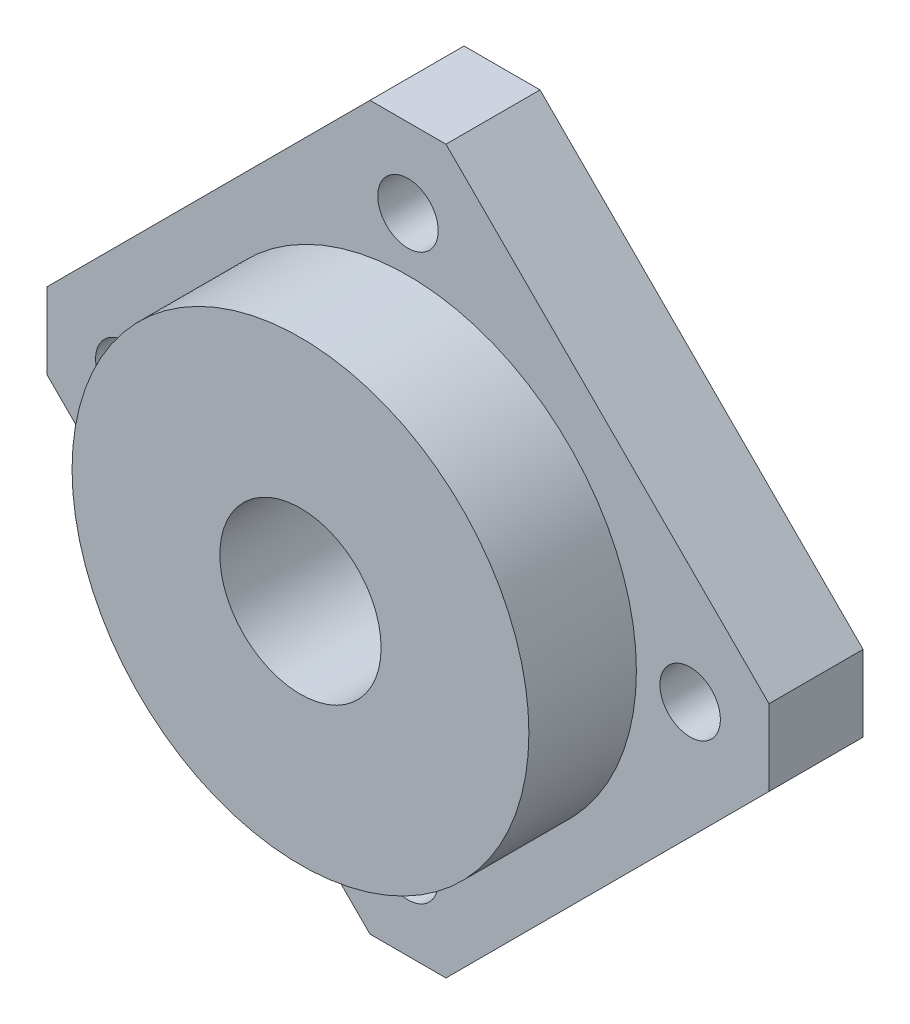
ISO-10303-21;
HEADER;
FILE_DESCRIPTION(('STEP AP214'),'2;1');
FILE_NAME('part.step','',(''),(''),'','','');
FILE_SCHEMA(('AUTOMOTIVE_DESIGN { 1 0 10303 214 1 1 1 1 }'));
ENDSEC;
DATA;
#1=APPLICATION_CONTEXT('core data for automotive mechanical design processes');
#2=APPLICATION_PROTOCOL_DEFINITION('international standard','automotive_design',2000,#1);
#3=PRODUCT_CONTEXT('',#1,'mechanical');
#4=PRODUCT('Part','Part','',(#3));
#5=PRODUCT_RELATED_PRODUCT_CATEGORY('part','',(#4));
#6=PRODUCT_DEFINITION_FORMATION('','',#4);
#7=PRODUCT_DEFINITION_CONTEXT('part definition',#1,'design');
#8=PRODUCT_DEFINITION('design','',#6,#7);
#9=PRODUCT_DEFINITION_SHAPE('','',#8);
#10=(LENGTH_UNIT() NAMED_UNIT(*) SI_UNIT(.MILLI.,.METRE.));
#11=(NAMED_UNIT(*) PLANE_ANGLE_UNIT() SI_UNIT($,.RADIAN.));
#12=(NAMED_UNIT(*) SI_UNIT($,.STERADIAN.) SOLID_ANGLE_UNIT());
#13=UNCERTAINTY_MEASURE_WITH_UNIT(LENGTH_MEASURE(1.E-05),#10,'distance_accuracy_value','');
#14=(GEOMETRIC_REPRESENTATION_CONTEXT(3) GLOBAL_UNCERTAINTY_ASSIGNED_CONTEXT((#13)) GLOBAL_UNIT_ASSIGNED_CONTEXT((#10,
#11,#12)) REPRESENTATION_CONTEXT('',''));
#15=CARTESIAN_POINT('',(0.,0.,0.));
#16=DIRECTION('',(0.,0.,1.));
#17=DIRECTION('',(1.,0.,0.));
#18=AXIS2_PLACEMENT_3D('',#15,#16,#17);
#19=CARTESIAN_POINT('',(0.,0.,7.));
#20=DIRECTION('',(0.,0.,-1.));
#21=DIRECTION('',(-1.,0.,0.));
#22=AXIS2_PLACEMENT_3D('',#19,#20,#21);
#23=PLANE('',#22);
#24=DIRECTION('',(0.707106781186547,-0.707106781186548,0.));
#25=VECTOR('',#24,1.);
#26=CARTESIAN_POINT('',(0.,-29.698484809835,7.));
#27=LINE('',#26,#25);
#28=CARTESIAN_POINT('',(-26.8700576850888,-2.8284271247462,7.));
#29=VERTEX_POINT('',#28);
#30=CARTESIAN_POINT('',(-2.8284271247462,-26.8700576850888,7.));
#31=VERTEX_POINT('',#30);
#32=EDGE_CURVE('E123',#29,#31,#27,.T.);
#33=ORIENTED_EDGE('',*,*,#32,.T.);
#34=DIRECTION('',(-1.,0.,0.));
#35=VECTOR('',#34,1.);
#36=CARTESIAN_POINT('',(2.82842712474619,-26.8700576850888,7.));
#37=LINE('',#36,#35);
#38=CARTESIAN_POINT('',(2.82842712474619,-26.8700576850888,7.));
#39=VERTEX_POINT('',#38);
#40=EDGE_CURVE('E11',#31,#39,#37,.F.);
#41=ORIENTED_EDGE('',*,*,#40,.T.);
#42=DIRECTION('',(0.707106781186547,0.707106781186547,0.));
#43=VECTOR('',#42,1.);
#44=CARTESIAN_POINT('',(29.698484809835,0.,7.));
#45=LINE('',#44,#43);
#46=CARTESIAN_POINT('',(26.8700576850888,-2.82842712474622,7.));
#47=VERTEX_POINT('',#46);
#48=EDGE_CURVE('E126',#39,#47,#45,.T.);
#49=ORIENTED_EDGE('',*,*,#48,.T.);
#50=DIRECTION('',(0.,-1.,0.));
#51=VECTOR('',#50,1.);
#52=CARTESIAN_POINT('',(26.8700576850888,2.8284271247462,7.));
#53=LINE('',#52,#51);
#54=CARTESIAN_POINT('',(26.8700576850888,2.82842712474619,7.));
#55=VERTEX_POINT('',#54);
#56=EDGE_CURVE('E167',#47,#55,#53,.F.);
#57=ORIENTED_EDGE('',*,*,#56,.T.);
#58=DIRECTION('',(-0.707106781186547,0.707106781186548,0.));
#59=VECTOR('',#58,1.);
#60=CARTESIAN_POINT('',(0.,29.698484809835,7.));
#61=LINE('',#60,#59);
#62=CARTESIAN_POINT('',(2.82842712474621,26.8700576850888,7.));
#63=VERTEX_POINT('',#62);
#64=EDGE_CURVE('E190',#55,#63,#61,.T.);
#65=ORIENTED_EDGE('',*,*,#64,.T.);
#66=DIRECTION('',(1.,0.,0.));
#67=VECTOR('',#66,1.);
#68=CARTESIAN_POINT('',(-2.82842712474619,26.8700576850888,7.));
#69=LINE('',#68,#67);
#70=CARTESIAN_POINT('',(-2.8284271247462,26.8700576850888,7.));
#71=VERTEX_POINT('',#70);
#72=EDGE_CURVE('E156',#63,#71,#69,.F.);
#73=ORIENTED_EDGE('',*,*,#72,.T.);
#74=DIRECTION('',(-0.707106781186548,-0.707106781186547,0.));
#75=VECTOR('',#74,1.);
#76=CARTESIAN_POINT('',(-29.698484809835,0.,7.));
#77=LINE('',#76,#75);
#78=CARTESIAN_POINT('',(-26.8700576850888,2.82842712474621,7.));
#79=VERTEX_POINT('',#78);
#80=EDGE_CURVE('E118',#71,#79,#77,.T.);
#81=ORIENTED_EDGE('',*,*,#80,.T.);
#82=DIRECTION('',(0.,1.,0.));
#83=VECTOR('',#82,1.);
#84=CARTESIAN_POINT('',(-26.8700576850888,-2.8284271247462,7.));
#85=LINE('',#84,#83);
#86=EDGE_CURVE('E175',#79,#29,#85,.F.);
#87=ORIENTED_EDGE('',*,*,#86,.T.);
#88=EDGE_LOOP('',(#33,#41,#49,#57,#65,#73,#81,#87));
#89=FACE_BOUND('',#88,.T.);
#90=CARTESIAN_POINT('',(0.,21.,7.));
#91=DIRECTION('',(0.,0.,1.));
#92=DIRECTION('',(1.,0.,0.));
#93=AXIS2_PLACEMENT_3D('',#90,#91,#92);
#94=CIRCLE('',#93,2.25);
#95=CARTESIAN_POINT('',(2.25,21.,7.));
#96=VERTEX_POINT('',#95);
#97=EDGE_CURVE('E136',#96,#96,#94,.T.);
#98=ORIENTED_EDGE('',*,*,#97,.F.);
#99=EDGE_LOOP('',(#98));
#100=FACE_BOUND('',#99,.T.);
#101=CARTESIAN_POINT('',(21.,0.,7.));
#102=DIRECTION('',(0.,0.,1.));
#103=DIRECTION('',(1.,0.,0.));
#104=AXIS2_PLACEMENT_3D('',#101,#102,#103);
#105=CIRCLE('',#104,2.25);
#106=CARTESIAN_POINT('',(23.25,0.,7.));
#107=VERTEX_POINT('',#106);
#108=EDGE_CURVE('E140',#107,#107,#105,.T.);
#109=ORIENTED_EDGE('',*,*,#108,.F.);
#110=EDGE_LOOP('',(#109));
#111=FACE_BOUND('',#110,.T.);
#112=CARTESIAN_POINT('',(0.,-21.,7.));
#113=DIRECTION('',(0.,0.,1.));
#114=DIRECTION('',(1.,0.,0.));
#115=AXIS2_PLACEMENT_3D('',#112,#113,#114);
#116=CIRCLE('',#115,2.25);
#117=CARTESIAN_POINT('',(2.25,-21.,7.));
#118=VERTEX_POINT('',#117);
#119=EDGE_CURVE('E144',#118,#118,#116,.T.);
#120=ORIENTED_EDGE('',*,*,#119,.F.);
#121=EDGE_LOOP('',(#120));
#122=FACE_BOUND('',#121,.T.);
#123=CARTESIAN_POINT('',(-21.,0.,7.));
#124=DIRECTION('',(0.,0.,1.));
#125=DIRECTION('',(1.,0.,0.));
#126=AXIS2_PLACEMENT_3D('',#123,#124,#125);
#127=CIRCLE('',#126,2.25);
#128=CARTESIAN_POINT('',(-18.75,0.,7.));
#129=VERTEX_POINT('',#128);
#130=EDGE_CURVE('E148',#129,#129,#127,.T.);
#131=ORIENTED_EDGE('',*,*,#130,.F.);
#132=EDGE_LOOP('',(#131));
#133=FACE_BOUND('',#132,.T.);
#134=CARTESIAN_POINT('',(0.,0.,7.));
#135=DIRECTION('',(0.,0.,-1.));
#136=DIRECTION('',(-1.,0.,0.));
#137=AXIS2_PLACEMENT_3D('',#134,#135,#136);
#138=CIRCLE('',#137,17.);
#139=CARTESIAN_POINT('',(-17.,0.,7.));
#140=VERTEX_POINT('',#139);
#141=EDGE_CURVE('E119',#140,#140,#138,.F.);
#142=ORIENTED_EDGE('',*,*,#141,.F.);
#143=EDGE_LOOP('',(#142));
#144=FACE_BOUND('',#143,.T.);
#145=ADVANCED_FACE('F35',(#89,#100,#111,#122,#133,#144),#23,.F.);
#146=CARTESIAN_POINT('',(0.,-29.698484809835,7.));
#147=DIRECTION('',(0.707106781186548,0.707106781186547,0.));
#148=DIRECTION('',(-0.707106781186547,0.707106781186548,0.));
#149=AXIS2_PLACEMENT_3D('',#146,#147,#148);
#150=PLANE('',#149);
#151=DIRECTION('',(0.707106781186547,-0.707106781186548,0.));
#152=VECTOR('',#151,1.);
#153=CARTESIAN_POINT('',(0.,-29.698484809835,0.));
#154=LINE('',#153,#152);
#155=CARTESIAN_POINT('',(-26.8700576850888,-2.82842712474621,0.));
#156=VERTEX_POINT('',#155);
#157=CARTESIAN_POINT('',(-2.8284271247462,-26.8700576850888,0.));
#158=VERTEX_POINT('',#157);
#159=EDGE_CURVE('E135',#156,#158,#154,.T.);
#160=ORIENTED_EDGE('',*,*,#159,.T.);
#161=DIRECTION('',(0.,0.,1.));
#162=VECTOR('',#161,1.);
#163=CARTESIAN_POINT('',(-2.8284271247462,-26.8700576850888,7.));
#164=LINE('',#163,#162);
#165=EDGE_CURVE('E43',#158,#31,#164,.T.);
#166=ORIENTED_EDGE('',*,*,#165,.T.);
#167=ORIENTED_EDGE('',*,*,#32,.F.);
#168=DIRECTION('',(0.,0.,-1.));
#169=VECTOR('',#168,1.);
#170=CARTESIAN_POINT('',(-26.8700576850888,-2.8284271247462,7.));
#171=LINE('',#170,#169);
#172=EDGE_CURVE('E169',#29,#156,#171,.T.);
#173=ORIENTED_EDGE('',*,*,#172,.T.);
#174=EDGE_LOOP('',(#160,#166,#167,#173));
#175=FACE_BOUND('',#174,.T.);
#176=ADVANCED_FACE('F222',(#175),#150,.F.);
#177=CARTESIAN_POINT('',(29.698484809835,0.,7.));
#178=DIRECTION('',(-0.707106781186547,0.707106781186547,0.));
#179=DIRECTION('',(-0.707106781186548,-0.707106781186548,0.));
#180=AXIS2_PLACEMENT_3D('',#177,#178,#179);
#181=PLANE('',#180);
#182=ORIENTED_EDGE('',*,*,#48,.F.);
#183=DIRECTION('',(0.,0.,-1.));
#184=VECTOR('',#183,1.);
#185=CARTESIAN_POINT('',(2.82842712474619,-26.8700576850888,7.));
#186=LINE('',#185,#184);
#187=CARTESIAN_POINT('',(2.82842712474619,-26.8700576850888,0.));
#188=VERTEX_POINT('',#187);
#189=EDGE_CURVE('E177',#39,#188,#186,.T.);
#190=ORIENTED_EDGE('',*,*,#189,.T.);
#191=DIRECTION('',(0.707106781186547,0.707106781186547,0.));
#192=VECTOR('',#191,1.);
#193=CARTESIAN_POINT('',(29.698484809835,0.,0.));
#194=LINE('',#193,#192);
#195=CARTESIAN_POINT('',(26.8700576850888,-2.82842712474622,0.));
#196=VERTEX_POINT('',#195);
#197=EDGE_CURVE('E128',#188,#196,#194,.T.);
#198=ORIENTED_EDGE('',*,*,#197,.T.);
#199=DIRECTION('',(0.,0.,1.));
#200=VECTOR('',#199,1.);
#201=CARTESIAN_POINT('',(26.8700576850888,-2.82842712474622,7.));
#202=LINE('',#201,#200);
#203=EDGE_CURVE('E164',#196,#47,#202,.T.);
#204=ORIENTED_EDGE('',*,*,#203,.T.);
#205=EDGE_LOOP('',(#182,#190,#198,#204));
#206=FACE_BOUND('',#205,.T.);
#207=ADVANCED_FACE('F183',(#206),#181,.F.);
#208=CARTESIAN_POINT('',(0.,29.698484809835,7.));
#209=DIRECTION('',(-0.707106781186548,-0.707106781186547,0.));
#210=DIRECTION('',(0.707106781186547,-0.707106781186548,0.));
#211=AXIS2_PLACEMENT_3D('',#208,#209,#210);
#212=PLANE('',#211);
#213=ORIENTED_EDGE('',*,*,#64,.F.);
#214=DIRECTION('',(0.,0.,-1.));
#215=VECTOR('',#214,1.);
#216=CARTESIAN_POINT('',(26.8700576850888,2.8284271247462,7.));
#217=LINE('',#216,#215);
#218=CARTESIAN_POINT('',(26.8700576850888,2.8284271247462,0.));
#219=VERTEX_POINT('',#218);
#220=EDGE_CURVE('E158',#55,#219,#217,.T.);
#221=ORIENTED_EDGE('',*,*,#220,.T.);
#222=DIRECTION('',(-0.707106781186547,0.707106781186548,0.));
#223=VECTOR('',#222,1.);
#224=CARTESIAN_POINT('',(0.,29.698484809835,0.));
#225=LINE('',#224,#223);
#226=CARTESIAN_POINT('',(2.82842712474621,26.8700576850888,0.));
#227=VERTEX_POINT('',#226);
#228=EDGE_CURVE('E124',#219,#227,#225,.T.);
#229=ORIENTED_EDGE('',*,*,#228,.T.);
#230=DIRECTION('',(0.,0.,1.));
#231=VECTOR('',#230,1.);
#232=CARTESIAN_POINT('',(2.82842712474621,26.8700576850888,7.));
#233=LINE('',#232,#231);
#234=EDGE_CURVE('E107',#227,#63,#233,.T.);
#235=ORIENTED_EDGE('',*,*,#234,.T.);
#236=EDGE_LOOP('',(#213,#221,#229,#235));
#237=FACE_BOUND('',#236,.T.);
#238=ADVANCED_FACE('F239',(#237),#212,.F.);
#239=CARTESIAN_POINT('',(-29.698484809835,0.,7.));
#240=DIRECTION('',(0.707106781186547,-0.707106781186548,0.));
#241=DIRECTION('',(0.707106781186548,0.707106781186547,0.));
#242=AXIS2_PLACEMENT_3D('',#239,#240,#241);
#243=PLANE('',#242);
#244=DIRECTION('',(-0.707106781186548,-0.707106781186547,0.));
#245=VECTOR('',#244,1.);
#246=CARTESIAN_POINT('',(-29.698484809835,0.,0.));
#247=LINE('',#246,#245);
#248=CARTESIAN_POINT('',(-2.82842712474619,26.8700576850888,0.));
#249=VERTEX_POINT('',#248);
#250=CARTESIAN_POINT('',(-26.8700576850888,2.82842712474621,0.));
#251=VERTEX_POINT('',#250);
#252=EDGE_CURVE('E115',#249,#251,#247,.T.);
#253=ORIENTED_EDGE('',*,*,#252,.T.);
#254=DIRECTION('',(0.,0.,1.));
#255=VECTOR('',#254,1.);
#256=CARTESIAN_POINT('',(-26.8700576850888,2.82842712474621,7.));
#257=LINE('',#256,#255);
#258=EDGE_CURVE('E173',#251,#79,#257,.T.);
#259=ORIENTED_EDGE('',*,*,#258,.T.);
#260=ORIENTED_EDGE('',*,*,#80,.F.);
#261=DIRECTION('',(0.,0.,-1.));
#262=VECTOR('',#261,1.);
#263=CARTESIAN_POINT('',(-2.82842712474619,26.8700576850888,7.));
#264=LINE('',#263,#262);
#265=EDGE_CURVE('E105',#71,#249,#264,.T.);
#266=ORIENTED_EDGE('',*,*,#265,.T.);
#267=EDGE_LOOP('',(#253,#259,#260,#266));
#268=FACE_BOUND('',#267,.T.);
#269=ADVANCED_FACE('F114',(#268),#243,.F.);
#270=CARTESIAN_POINT('',(0.,0.,0.));
#271=DIRECTION('',(0.,0.,-1.));
#272=DIRECTION('',(-1.,0.,0.));
#273=AXIS2_PLACEMENT_3D('',#270,#271,#272);
#274=PLANE('',#273);
#275=CARTESIAN_POINT('',(0.,0.,0.));
#276=DIRECTION('',(0.,0.,-1.));
#277=DIRECTION('',(-1.,0.,0.));
#278=AXIS2_PLACEMENT_3D('',#275,#276,#277);
#279=CIRCLE('',#278,6.);
#280=CARTESIAN_POINT('',(-6.,0.,0.));
#281=VERTEX_POINT('',#280);
#282=EDGE_CURVE('E149',#281,#281,#279,.T.);
#283=ORIENTED_EDGE('',*,*,#282,.F.);
#284=EDGE_LOOP('',(#283));
#285=FACE_BOUND('',#284,.T.);
#286=CARTESIAN_POINT('',(-21.,0.,0.));
#287=DIRECTION('',(0.,0.,-1.));
#288=DIRECTION('',(-1.,0.,0.));
#289=AXIS2_PLACEMENT_3D('',#286,#287,#288);
#290=CIRCLE('',#289,2.25);
#291=CARTESIAN_POINT('',(-23.25,0.,0.));
#292=VERTEX_POINT('',#291);
#293=EDGE_CURVE('E145',#292,#292,#290,.T.);
#294=ORIENTED_EDGE('',*,*,#293,.F.);
#295=EDGE_LOOP('',(#294));
#296=FACE_BOUND('',#295,.T.);
#297=CARTESIAN_POINT('',(0.,-21.,0.));
#298=DIRECTION('',(0.,0.,-1.));
#299=DIRECTION('',(-1.,0.,0.));
#300=AXIS2_PLACEMENT_3D('',#297,#298,#299);
#301=CIRCLE('',#300,2.25);
#302=CARTESIAN_POINT('',(-2.25,-21.,0.));
#303=VERTEX_POINT('',#302);
#304=EDGE_CURVE('E141',#303,#303,#301,.T.);
#305=ORIENTED_EDGE('',*,*,#304,.F.);
#306=EDGE_LOOP('',(#305));
#307=FACE_BOUND('',#306,.T.);
#308=CARTESIAN_POINT('',(21.,0.,0.));
#309=DIRECTION('',(0.,0.,-1.));
#310=DIRECTION('',(-1.,0.,0.));
#311=AXIS2_PLACEMENT_3D('',#308,#309,#310);
#312=CIRCLE('',#311,2.25);
#313=CARTESIAN_POINT('',(18.75,0.,0.));
#314=VERTEX_POINT('',#313);
#315=EDGE_CURVE('E137',#314,#314,#312,.T.);
#316=ORIENTED_EDGE('',*,*,#315,.F.);
#317=EDGE_LOOP('',(#316));
#318=FACE_BOUND('',#317,.T.);
#319=CARTESIAN_POINT('',(0.,21.,0.));
#320=DIRECTION('',(0.,0.,-1.));
#321=DIRECTION('',(-1.,0.,0.));
#322=AXIS2_PLACEMENT_3D('',#319,#320,#321);
#323=CIRCLE('',#322,2.25);
#324=CARTESIAN_POINT('',(-2.25,21.,0.));
#325=VERTEX_POINT('',#324);
#326=EDGE_CURVE('E132',#325,#325,#323,.T.);
#327=ORIENTED_EDGE('',*,*,#326,.F.);
#328=EDGE_LOOP('',(#327));
#329=FACE_BOUND('',#328,.T.);
#330=ORIENTED_EDGE('',*,*,#197,.F.);
#331=DIRECTION('',(1.,0.,0.));
#332=VECTOR('',#331,1.);
#333=CARTESIAN_POINT('',(0.,-26.8700576850888,0.));
#334=LINE('',#333,#332);
#335=EDGE_CURVE('E57',#188,#158,#334,.F.);
#336=ORIENTED_EDGE('',*,*,#335,.T.);
#337=ORIENTED_EDGE('',*,*,#159,.F.);
#338=DIRECTION('',(0.,-1.,0.));
#339=VECTOR('',#338,1.);
#340=CARTESIAN_POINT('',(-26.8700576850888,0.,0.));
#341=LINE('',#340,#339);
#342=EDGE_CURVE('E122',#156,#251,#341,.F.);
#343=ORIENTED_EDGE('',*,*,#342,.T.);
#344=ORIENTED_EDGE('',*,*,#252,.F.);
#345=DIRECTION('',(-1.,0.,0.));
#346=VECTOR('',#345,1.);
#347=CARTESIAN_POINT('',(0.,26.8700576850888,0.));
#348=LINE('',#347,#346);
#349=EDGE_CURVE('E101',#249,#227,#348,.F.);
#350=ORIENTED_EDGE('',*,*,#349,.T.);
#351=ORIENTED_EDGE('',*,*,#228,.F.);
#352=DIRECTION('',(0.,1.,0.));
#353=VECTOR('',#352,1.);
#354=CARTESIAN_POINT('',(26.8700576850888,0.,0.));
#355=LINE('',#354,#353);
#356=EDGE_CURVE('E161',#219,#196,#355,.F.);
#357=ORIENTED_EDGE('',*,*,#356,.T.);
#358=EDGE_LOOP('',(#330,#336,#337,#343,#344,#350,#351,#357));
#359=FACE_BOUND('',#358,.T.);
#360=ADVANCED_FACE('F121',(#285,#296,#307,#318,#329,#359),#274,.T.);
#361=CARTESIAN_POINT('',(0.,21.,-13.));
#362=DIRECTION('',(0.,0.,1.));
#363=DIRECTION('',(1.,0.,0.));
#364=AXIS2_PLACEMENT_3D('',#361,#362,#363);
#365=CYLINDRICAL_SURFACE('',#364,2.25);
#366=ORIENTED_EDGE('',*,*,#326,.T.);
#367=EDGE_LOOP('',(#366));
#368=FACE_BOUND('',#367,.T.);
#369=ORIENTED_EDGE('',*,*,#97,.T.);
#370=EDGE_LOOP('',(#369));
#371=FACE_BOUND('',#370,.T.);
#372=ADVANCED_FACE('F232',(#368,#371),#365,.F.);
#373=CARTESIAN_POINT('',(21.,0.,-13.));
#374=DIRECTION('',(0.,0.,1.));
#375=DIRECTION('',(1.,0.,0.));
#376=AXIS2_PLACEMENT_3D('',#373,#374,#375);
#377=CYLINDRICAL_SURFACE('',#376,2.25);
#378=ORIENTED_EDGE('',*,*,#315,.T.);
#379=EDGE_LOOP('',(#378));
#380=FACE_BOUND('',#379,.T.);
#381=ORIENTED_EDGE('',*,*,#108,.T.);
#382=EDGE_LOOP('',(#381));
#383=FACE_BOUND('',#382,.T.);
#384=ADVANCED_FACE('F358',(#380,#383),#377,.F.);
#385=CARTESIAN_POINT('',(0.,-21.,-13.));
#386=DIRECTION('',(0.,0.,1.));
#387=DIRECTION('',(1.,0.,0.));
#388=AXIS2_PLACEMENT_3D('',#385,#386,#387);
#389=CYLINDRICAL_SURFACE('',#388,2.25);
#390=ORIENTED_EDGE('',*,*,#304,.T.);
#391=EDGE_LOOP('',(#390));
#392=FACE_BOUND('',#391,.T.);
#393=ORIENTED_EDGE('',*,*,#119,.T.);
#394=EDGE_LOOP('',(#393));
#395=FACE_BOUND('',#394,.T.);
#396=ADVANCED_FACE('F348',(#392,#395),#389,.F.);
#397=CARTESIAN_POINT('',(-21.,0.,-13.));
#398=DIRECTION('',(0.,0.,1.));
#399=DIRECTION('',(1.,0.,0.));
#400=AXIS2_PLACEMENT_3D('',#397,#398,#399);
#401=CYLINDRICAL_SURFACE('',#400,2.25);
#402=ORIENTED_EDGE('',*,*,#293,.T.);
#403=EDGE_LOOP('',(#402));
#404=FACE_BOUND('',#403,.T.);
#405=ORIENTED_EDGE('',*,*,#130,.T.);
#406=EDGE_LOOP('',(#405));
#407=FACE_BOUND('',#406,.T.);
#408=ADVANCED_FACE('F338',(#404,#407),#401,.F.);
#409=CARTESIAN_POINT('',(0.,0.,-13.));
#410=DIRECTION('',(0.,0.,1.));
#411=DIRECTION('',(1.,0.,0.));
#412=AXIS2_PLACEMENT_3D('',#409,#410,#411);
#413=CYLINDRICAL_SURFACE('',#412,6.);
#414=ORIENTED_EDGE('',*,*,#282,.T.);
#415=EDGE_LOOP('',(#414));
#416=FACE_BOUND('',#415,.T.);
#417=CARTESIAN_POINT('',(0.,0.,15.));
#418=DIRECTION('',(0.,0.,1.));
#419=DIRECTION('',(1.,0.,0.));
#420=AXIS2_PLACEMENT_3D('',#417,#418,#419);
#421=CIRCLE('',#420,6.);
#422=CARTESIAN_POINT('',(6.,0.,15.));
#423=VERTEX_POINT('',#422);
#424=EDGE_CURVE('E203',#423,#423,#421,.T.);
#425=ORIENTED_EDGE('',*,*,#424,.T.);
#426=EDGE_LOOP('',(#425));
#427=FACE_BOUND('',#426,.T.);
#428=ADVANCED_FACE('F207',(#416,#427),#413,.F.);
#429=CARTESIAN_POINT('',(0.,0.,15.));
#430=DIRECTION('',(0.,0.,-1.));
#431=DIRECTION('',(-1.,0.,0.));
#432=AXIS2_PLACEMENT_3D('',#429,#430,#431);
#433=CYLINDRICAL_SURFACE('',#432,17.);
#434=CARTESIAN_POINT('',(0.,0.,15.));
#435=DIRECTION('',(0.,0.,1.));
#436=DIRECTION('',(1.,0.,0.));
#437=AXIS2_PLACEMENT_3D('',#434,#435,#436);
#438=CIRCLE('',#437,17.);
#439=CARTESIAN_POINT('',(17.,0.,15.));
#440=VERTEX_POINT('',#439);
#441=EDGE_CURVE('E152',#440,#440,#438,.T.);
#442=ORIENTED_EDGE('',*,*,#441,.F.);
#443=EDGE_LOOP('',(#442));
#444=FACE_BOUND('',#443,.T.);
#445=ORIENTED_EDGE('',*,*,#141,.T.);
#446=EDGE_LOOP('',(#445));
#447=FACE_BOUND('',#446,.T.);
#448=ADVANCED_FACE('F212',(#444,#447),#433,.T.);
#449=CARTESIAN_POINT('',(0.,0.,15.));
#450=DIRECTION('',(0.,0.,1.));
#451=DIRECTION('',(1.,0.,0.));
#452=AXIS2_PLACEMENT_3D('',#449,#450,#451);
#453=PLANE('',#452);
#454=ORIENTED_EDGE('',*,*,#424,.F.);
#455=EDGE_LOOP('',(#454));
#456=FACE_BOUND('',#455,.T.);
#457=ORIENTED_EDGE('',*,*,#441,.T.);
#458=EDGE_LOOP('',(#457));
#459=FACE_BOUND('',#458,.T.);
#460=ADVANCED_FACE('F209',(#456,#459),#453,.T.);
#461=CARTESIAN_POINT('',(-2.82842712474619,26.8700576850888,7.));
#462=DIRECTION('',(0.,-1.,0.));
#463=DIRECTION('',(0.,0.,-1.));
#464=AXIS2_PLACEMENT_3D('',#461,#462,#463);
#465=PLANE('',#464);
#466=ORIENTED_EDGE('',*,*,#72,.F.);
#467=ORIENTED_EDGE('',*,*,#234,.F.);
#468=ORIENTED_EDGE('',*,*,#349,.F.);
#469=ORIENTED_EDGE('',*,*,#265,.F.);
#470=EDGE_LOOP('',(#466,#467,#468,#469));
#471=FACE_BOUND('',#470,.T.);
#472=ADVANCED_FACE('F104',(#471),#465,.F.);
#473=CARTESIAN_POINT('',(26.8700576850888,2.8284271247462,7.));
#474=DIRECTION('',(-1.,0.,0.));
#475=DIRECTION('',(0.,0.,-1.));
#476=AXIS2_PLACEMENT_3D('',#473,#474,#475);
#477=PLANE('',#476);
#478=ORIENTED_EDGE('',*,*,#56,.F.);
#479=ORIENTED_EDGE('',*,*,#203,.F.);
#480=ORIENTED_EDGE('',*,*,#356,.F.);
#481=ORIENTED_EDGE('',*,*,#220,.F.);
#482=EDGE_LOOP('',(#478,#479,#480,#481));
#483=FACE_BOUND('',#482,.T.);
#484=ADVANCED_FACE('F247',(#483),#477,.F.);
#485=CARTESIAN_POINT('',(-26.8700576850888,-2.8284271247462,7.));
#486=DIRECTION('',(1.,0.,0.));
#487=DIRECTION('',(0.,0.,-1.));
#488=AXIS2_PLACEMENT_3D('',#485,#486,#487);
#489=PLANE('',#488);
#490=ORIENTED_EDGE('',*,*,#86,.F.);
#491=ORIENTED_EDGE('',*,*,#258,.F.);
#492=ORIENTED_EDGE('',*,*,#342,.F.);
#493=ORIENTED_EDGE('',*,*,#172,.F.);
#494=EDGE_LOOP('',(#490,#491,#492,#493));
#495=FACE_BOUND('',#494,.T.);
#496=ADVANCED_FACE('F249',(#495),#489,.F.);
#497=CARTESIAN_POINT('',(2.82842712474619,-26.8700576850888,7.));
#498=DIRECTION('',(0.,1.,0.));
#499=DIRECTION('',(0.,0.,-1.));
#500=AXIS2_PLACEMENT_3D('',#497,#498,#499);
#501=PLANE('',#500);
#502=ORIENTED_EDGE('',*,*,#40,.F.);
#503=ORIENTED_EDGE('',*,*,#165,.F.);
#504=ORIENTED_EDGE('',*,*,#335,.F.);
#505=ORIENTED_EDGE('',*,*,#189,.F.);
#506=EDGE_LOOP('',(#502,#503,#504,#505));
#507=FACE_BOUND('',#506,.T.);
#508=ADVANCED_FACE('F37',(#507),#501,.F.);
#509=CLOSED_SHELL('',(#145,#176,#207,#238,#269,#360,#372,#384,#396,#408,#428,#448,#460,#472,
#484,#496,#508));
#510=MANIFOLD_SOLID_BREP('B2',#509);
#511=ADVANCED_BREP_SHAPE_REPRESENTATION('',(#18,#510),#14);
#512=SHAPE_DEFINITION_REPRESENTATION(#9,#511);
ENDSEC;
END-ISO-10303-21;
